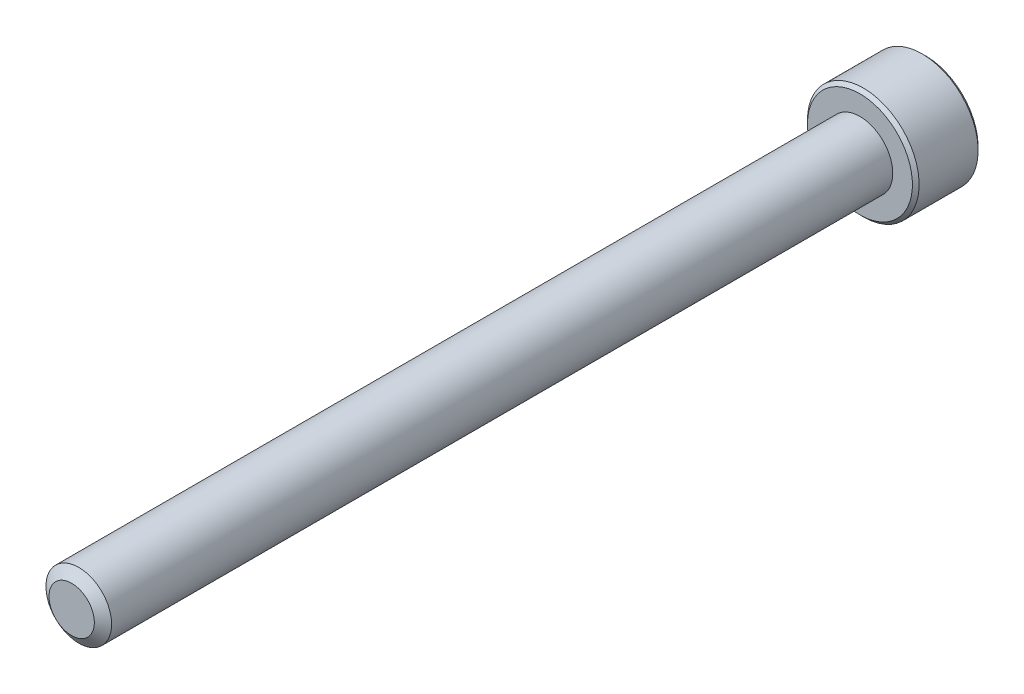
ISO-10303-21;
HEADER;
FILE_DESCRIPTION(('STEP AP214'),'2;1');
FILE_NAME('part.step','',(''),(''),'','','');
FILE_SCHEMA(('AUTOMOTIVE_DESIGN { 1 0 10303 214 1 1 1 1 }'));
ENDSEC;
DATA;
#1=APPLICATION_CONTEXT('core data for automotive mechanical design processes');
#2=APPLICATION_PROTOCOL_DEFINITION('international standard','automotive_design',2000,#1);
#3=PRODUCT_CONTEXT('',#1,'mechanical');
#4=PRODUCT('Part','Part','',(#3));
#5=PRODUCT_RELATED_PRODUCT_CATEGORY('part','',(#4));
#6=PRODUCT_DEFINITION_FORMATION('','',#4);
#7=PRODUCT_DEFINITION_CONTEXT('part definition',#1,'design');
#8=PRODUCT_DEFINITION('design','',#6,#7);
#9=PRODUCT_DEFINITION_SHAPE('','',#8);
#10=(LENGTH_UNIT() NAMED_UNIT(*) SI_UNIT(.MILLI.,.METRE.));
#11=(NAMED_UNIT(*) PLANE_ANGLE_UNIT() SI_UNIT($,.RADIAN.));
#12=(NAMED_UNIT(*) SI_UNIT($,.STERADIAN.) SOLID_ANGLE_UNIT());
#13=UNCERTAINTY_MEASURE_WITH_UNIT(LENGTH_MEASURE(1.E-05),#10,'distance_accuracy_value','');
#14=(GEOMETRIC_REPRESENTATION_CONTEXT(3) GLOBAL_UNCERTAINTY_ASSIGNED_CONTEXT((#13)) GLOBAL_UNIT_ASSIGNED_CONTEXT((#10,
#11,#12)) REPRESENTATION_CONTEXT('',''));
#15=CARTESIAN_POINT('',(0.,0.,0.));
#16=DIRECTION('',(0.,0.,1.));
#17=DIRECTION('',(1.,0.,0.));
#18=AXIS2_PLACEMENT_3D('',#15,#16,#17);
#19=CARTESIAN_POINT('',(0.,0.,-60.));
#20=DIRECTION('',(0.,0.,1.));
#21=DIRECTION('',(1.,0.,0.));
#22=AXIS2_PLACEMENT_3D('',#19,#20,#21);
#23=CYLINDRICAL_SURFACE('',#22,2.5);
#24=CARTESIAN_POINT('',(0.,0.,-0.541691224311849));
#25=DIRECTION('',(0.,0.,1.));
#26=DIRECTION('',(1.,0.,0.));
#27=AXIS2_PLACEMENT_3D('',#24,#25,#26);
#28=CIRCLE('',#27,2.5);
#29=CARTESIAN_POINT('',(2.5,0.,-0.541691224311849));
#30=VERTEX_POINT('',#29);
#31=EDGE_CURVE('E118',#30,#30,#28,.T.);
#32=ORIENTED_EDGE('',*,*,#31,.F.);
#33=EDGE_LOOP('',(#32));
#34=FACE_BOUND('',#33,.T.);
#35=CARTESIAN_POINT('',(0.,0.,-60.));
#36=DIRECTION('',(0.,0.,-1.));
#37=DIRECTION('',(-1.,0.,0.));
#38=AXIS2_PLACEMENT_3D('',#35,#36,#37);
#39=CIRCLE('',#38,2.5);
#40=CARTESIAN_POINT('',(-2.5,0.,-60.));
#41=VERTEX_POINT('',#40);
#42=EDGE_CURVE('E233',#41,#41,#39,.F.);
#43=ORIENTED_EDGE('',*,*,#42,.T.);
#44=EDGE_LOOP('',(#43));
#45=FACE_BOUND('',#44,.T.);
#46=ADVANCED_FACE('F41',(#34,#45),#23,.T.);
#47=CARTESIAN_POINT('',(0.,0.,0.));
#48=DIRECTION('',(0.,0.,-1.));
#49=DIRECTION('',(-1.,0.,0.));
#50=AXIS2_PLACEMENT_3D('',#47,#48,#49);
#51=CONICAL_SURFACE('',#50,1.72638475772933,0.959931088596884);
#52=ORIENTED_EDGE('',*,*,#31,.T.);
#53=EDGE_LOOP('',(#52));
#54=FACE_BOUND('',#53,.T.);
#55=CARTESIAN_POINT('',(0.,0.,0.));
#56=DIRECTION('',(0.,0.,1.));
#57=DIRECTION('',(1.,0.,0.));
#58=AXIS2_PLACEMENT_3D('',#55,#56,#57);
#59=CIRCLE('',#58,1.72638475772933);
#60=CARTESIAN_POINT('',(1.72638475772933,0.,0.));
#61=VERTEX_POINT('',#60);
#62=EDGE_CURVE('E230',#61,#61,#59,.T.);
#63=ORIENTED_EDGE('',*,*,#62,.F.);
#64=EDGE_LOOP('',(#63));
#65=FACE_BOUND('',#64,.T.);
#66=ADVANCED_FACE('F213',(#54,#65),#51,.T.);
#67=CARTESIAN_POINT('',(0.,0.,0.));
#68=DIRECTION('',(0.,0.,1.));
#69=DIRECTION('',(1.,0.,0.));
#70=AXIS2_PLACEMENT_3D('',#67,#68,#69);
#71=PLANE('',#70);
#72=ORIENTED_EDGE('',*,*,#62,.T.);
#73=EDGE_LOOP('',(#72));
#74=FACE_BOUND('',#73,.T.);
#75=ADVANCED_FACE('F210',(#74),#71,.T.);
#76=CARTESIAN_POINT('',(0.,0.,-65.));
#77=DIRECTION('',(0.,0.,1.));
#78=DIRECTION('',(1.,0.,0.));
#79=AXIS2_PLACEMENT_3D('',#76,#77,#78);
#80=CYLINDRICAL_SURFACE('',#79,4.25);
#81=CARTESIAN_POINT('',(0.,0.,-64.745));
#82=DIRECTION('',(0.,0.,-1.));
#83=DIRECTION('',(-1.,0.,0.));
#84=AXIS2_PLACEMENT_3D('',#81,#82,#83);
#85=CIRCLE('',#84,4.25);
#86=CARTESIAN_POINT('',(-4.25,0.,-64.745));
#87=VERTEX_POINT('',#86);
#88=EDGE_CURVE('E50',#87,#87,#85,.F.);
#89=ORIENTED_EDGE('',*,*,#88,.T.);
#90=EDGE_LOOP('',(#89));
#91=FACE_BOUND('',#90,.T.);
#92=CARTESIAN_POINT('',(0.,0.,-60.255));
#93=DIRECTION('',(0.,0.,-1.));
#94=DIRECTION('',(-1.,0.,0.));
#95=AXIS2_PLACEMENT_3D('',#92,#93,#94);
#96=CIRCLE('',#95,4.25);
#97=CARTESIAN_POINT('',(-4.25,0.,-60.255));
#98=VERTEX_POINT('',#97);
#99=EDGE_CURVE('E187',#98,#98,#96,.T.);
#100=ORIENTED_EDGE('',*,*,#99,.T.);
#101=EDGE_LOOP('',(#100));
#102=FACE_BOUND('',#101,.T.);
#103=ADVANCED_FACE('F194',(#91,#102),#80,.T.);
#104=CARTESIAN_POINT('',(0.,0.,-65.));
#105=DIRECTION('',(0.,0.,-1.));
#106=DIRECTION('',(-1.,0.,0.));
#107=AXIS2_PLACEMENT_3D('',#104,#105,#106);
#108=PLANE('',#107);
#109=CARTESIAN_POINT('',(0.,0.,-65.));
#110=DIRECTION('',(0.,0.,-1.));
#111=DIRECTION('',(-1.,0.,0.));
#112=AXIS2_PLACEMENT_3D('',#109,#110,#111);
#113=CIRCLE('',#112,3.99499999999998);
#114=CARTESIAN_POINT('',(-3.99499999999998,0.,-65.));
#115=VERTEX_POINT('',#114);
#116=EDGE_CURVE('E117',#115,#115,#113,.T.);
#117=ORIENTED_EDGE('',*,*,#116,.T.);
#118=EDGE_LOOP('',(#117));
#119=FACE_BOUND('',#118,.T.);
#120=CARTESIAN_POINT('',(0.,0.,-65.));
#121=DIRECTION('',(0.,0.,-1.));
#122=DIRECTION('',(-1.,0.,0.));
#123=AXIS2_PLACEMENT_3D('',#120,#121,#122);
#124=CIRCLE('',#123,2.3094010767585);
#125=CARTESIAN_POINT('',(-1.99999999999999,1.15470053837926,-65.));
#126=VERTEX_POINT('',#125);
#127=CARTESIAN_POINT('',(0.,2.3094010767585,-65.));
#128=VERTEX_POINT('',#127);
#129=EDGE_CURVE('E96',#126,#128,#124,.T.);
#130=ORIENTED_EDGE('',*,*,#129,.F.);
#131=CARTESIAN_POINT('',(-1.99999999999999,-1.15470053837926,-65.));
#132=VERTEX_POINT('',#131);
#133=EDGE_CURVE('E56',#132,#126,#124,.T.);
#134=ORIENTED_EDGE('',*,*,#133,.F.);
#135=CARTESIAN_POINT('',(0.,-2.3094010767585,-65.));
#136=VERTEX_POINT('',#135);
#137=EDGE_CURVE('E307',#136,#132,#124,.T.);
#138=ORIENTED_EDGE('',*,*,#137,.F.);
#139=CARTESIAN_POINT('',(1.99999999999999,-1.15470053837926,-65.));
#140=VERTEX_POINT('',#139);
#141=EDGE_CURVE('E63',#140,#136,#124,.T.);
#142=ORIENTED_EDGE('',*,*,#141,.F.);
#143=CARTESIAN_POINT('',(2.,1.15470053837926,-65.));
#144=VERTEX_POINT('',#143);
#145=EDGE_CURVE('E141',#144,#140,#124,.T.);
#146=ORIENTED_EDGE('',*,*,#145,.F.);
#147=EDGE_CURVE('E106',#128,#144,#124,.T.);
#148=ORIENTED_EDGE('',*,*,#147,.F.);
#149=EDGE_LOOP('',(#130,#134,#138,#142,#146,#148));
#150=FACE_BOUND('',#149,.T.);
#151=ADVANCED_FACE('F140',(#119,#150),#108,.T.);
#152=CARTESIAN_POINT('',(0.,0.,-60.));
#153=DIRECTION('',(0.,0.,-1.));
#154=DIRECTION('',(-1.,0.,0.));
#155=AXIS2_PLACEMENT_3D('',#152,#153,#154);
#156=PLANE('',#155);
#157=CARTESIAN_POINT('',(0.,0.,-60.));
#158=DIRECTION('',(0.,0.,-1.));
#159=DIRECTION('',(-1.,0.,0.));
#160=AXIS2_PLACEMENT_3D('',#157,#158,#159);
#161=CIRCLE('',#160,3.99499999999999);
#162=CARTESIAN_POINT('',(-3.99499999999999,0.,-60.));
#163=VERTEX_POINT('',#162);
#164=EDGE_CURVE('E11',#163,#163,#161,.F.);
#165=ORIENTED_EDGE('',*,*,#164,.T.);
#166=EDGE_LOOP('',(#165));
#167=FACE_BOUND('',#166,.T.);
#168=ORIENTED_EDGE('',*,*,#42,.F.);
#169=EDGE_LOOP('',(#168));
#170=FACE_BOUND('',#169,.T.);
#171=ADVANCED_FACE('F203',(#167,#170),#156,.F.);
#172=CARTESIAN_POINT('',(0.,0.,-65.));
#173=DIRECTION('',(0.,0.,-1.));
#174=DIRECTION('',(-1.,0.,0.));
#175=AXIS2_PLACEMENT_3D('',#172,#173,#174);
#176=CONICAL_SURFACE('',#175,2.3094010767585,0.78539816339745);
#177=ORIENTED_EDGE('',*,*,#147,.T.);
#178=CARTESIAN_POINT('',(-0.000199999999999274,2.30951654681234,-65.0001154787137));
#179=CARTESIAN_POINT('',(0.0685530340307071,2.26982196410711,-64.9604530902256));
#180=CARTESIAN_POINT('',(0.138455742135516,2.22946361676571,-64.9231199822842));
#181=CARTESIAN_POINT('',(0.280995244550443,2.1471683966763,-64.8547636851361));
#182=CARTESIAN_POINT('',(0.353645597565364,2.10522369580641,-64.8237785337372));
#183=CARTESIAN_POINT('',(0.500141601053975,2.02064418875706,-64.7707002165441));
#184=CARTESIAN_POINT('',(0.573949935246298,1.97803092714268,-64.7484736271766));
#185=CARTESIAN_POINT('',(0.723191631835266,1.89186619344273,-64.7142288166751));
#186=CARTESIAN_POINT('',(0.798620433918153,1.84831735425552,-64.7021850291441));
#187=CARTESIAN_POINT('',(0.92861550067108,1.7732646674724,-64.6913185119056));
#188=CARTESIAN_POINT('',(0.983013783970109,1.74185780396625,-64.68970975361));
#189=CARTESIAN_POINT('',(1.09172145551969,1.67909540053412,-64.6924188775987));
#190=CARTESIAN_POINT('',(1.14603080592134,1.64773988246021,-64.696738837758));
#191=CARTESIAN_POINT('',(1.25413672758934,1.5853248994842,-64.7110595674099));
#192=CARTESIAN_POINT('',(1.30793265655479,1.55426580541469,-64.721066692762));
#193=CARTESIAN_POINT('',(1.41459426230557,1.49268469862228,-64.7462124302497));
#194=CARTESIAN_POINT('',(1.46746001007071,1.46216264491917,-64.7613506490422));
#195=CARTESIAN_POINT('',(1.60287973308984,1.38397803138049,-64.8062945034292));
#196=CARTESIAN_POINT('',(1.68459383484948,1.33680037273297,-64.8394888394258));
#197=CARTESIAN_POINT('',(1.8047470372578,1.26742988897853,-64.8955258231714));
#198=CARTESIAN_POINT('',(1.84434285210917,1.24456923461531,-64.9152147029469));
#199=CARTESIAN_POINT('',(1.92280095888787,1.19927142554652,-64.9563873183649));
#200=CARTESIAN_POINT('',(1.96166368359374,1.17683402097615,-64.9778699516513));
#201=CARTESIAN_POINT('',(2.0002,1.15458506832542,-65.0001154787137));
#202=B_SPLINE_CURVE_WITH_KNOTS('',3,(#178,#179,#180,#181,#182,#183,#184,#185,#186,#187,#188,
#189,#190,#191,#192,#193,#194,#195,#196,#197,#198,#199,#200,#201),.UNSPECIFIED.,.F.,.F.,(4,2,2,
2,2,2,2,2,2,2,2,4),(0.,0.266420613771074,0.534393751523391,0.798110374376918,1.06116288956936,
1.24939906803722,1.43770123566247,1.62621426093931,1.81471283831913,2.11415604834145,
2.2634717071779,2.41269626969771),.UNSPECIFIED.);
#203=EDGE_CURVE('E111',#128,#144,#202,.T.);
#204=ORIENTED_EDGE('',*,*,#203,.F.);
#205=EDGE_LOOP('',(#177,#204));
#206=FACE_BOUND('',#205,.T.);
#207=ADVANCED_FACE('F112',(#206),#176,.F.);
#208=ORIENTED_EDGE('',*,*,#145,.T.);
#209=CARTESIAN_POINT('',(1.99999999999999,-2.3029441732643,-65.7407713552807));
#210=CARTESIAN_POINT('',(1.99999999999999,-2.24687002696279,-65.6984432738692));
#211=CARTESIAN_POINT('',(1.99999999999999,-2.19048190568583,-65.6565251570979));
#212=CARTESIAN_POINT('',(1.99999999999999,-2.07695390526152,-65.5736904180751));
#213=CARTESIAN_POINT('',(1.99999999999999,-2.01981384095229,-65.5327740498725));
#214=CARTESIAN_POINT('',(1.99999999999999,-1.90424016831613,-65.4518334522036));
#215=CARTESIAN_POINT('',(1.99999999999999,-1.84579996769762,-65.4118185917351));
#216=CARTESIAN_POINT('',(1.99999999999999,-1.72792745485624,-65.3332889938202));
#217=CARTESIAN_POINT('',(1.99999999999999,-1.66849521315185,-65.2947741503895));
#218=CARTESIAN_POINT('',(1.99999999999999,-1.48162995729572,-65.1776406517203));
#219=CARTESIAN_POINT('',(1.99999999999999,-1.35220318180736,-65.1021459018253));
#220=CARTESIAN_POINT('',(1.99999999999999,-1.08689521605219,-64.9640493510523));
#221=CARTESIAN_POINT('',(2.,-0.951037764035625,-64.901404085944));
#222=CARTESIAN_POINT('',(2.,-0.747111912337648,-64.8247635439027));
#223=CARTESIAN_POINT('',(2.,-0.682064034234154,-64.8027671799473));
#224=CARTESIAN_POINT('',(2.,-0.550398103397371,-64.7639966876877));
#225=CARTESIAN_POINT('',(2.,-0.483779942833396,-64.7472229191476));
#226=CARTESIAN_POINT('',(2.,-0.350484328974905,-64.7200482579067));
#227=CARTESIAN_POINT('',(2.,-0.28382948950006,-64.709538176761));
#228=CARTESIAN_POINT('',(2.,-0.14980698729043,-64.6950960855565));
#229=CARTESIAN_POINT('',(2.,-0.0824394490929301,-64.6911629447399));
#230=CARTESIAN_POINT('',(2.,0.0499055621213727,-64.6901664769296));
#231=CARTESIAN_POINT('',(2.,0.114881284963481,-64.6928596448403));
#232=CARTESIAN_POINT('',(2.,0.24427592129058,-64.7044300703996));
#233=CARTESIAN_POINT('',(2.,0.308694780068657,-64.7133079288031));
#234=CARTESIAN_POINT('',(2.,0.43759978840093,-64.7369136592514));
#235=CARTESIAN_POINT('',(2.,0.502067428429075,-64.7517410833941));
#236=CARTESIAN_POINT('',(2.,0.629594322371848,-64.78645788356));
#237=CARTESIAN_POINT('',(2.,0.6926536936515,-64.8063468360305));
#238=CARTESIAN_POINT('',(2.,0.891187888928451,-64.8764469791434));
#239=CARTESIAN_POINT('',(2.,1.02383545674825,-64.9346418001746));
#240=CARTESIAN_POINT('',(2.,1.28290932109376,-65.0640305752408));
#241=CARTESIAN_POINT('',(2.,1.40931112542929,-65.1352712311583));
#242=CARTESIAN_POINT('',(2.,1.59200441388851,-65.2464419915627));
#243=CARTESIAN_POINT('',(2.,1.65027548974477,-65.2831821900083));
#244=CARTESIAN_POINT('',(2.,1.7658176033435,-65.3582145138205));
#245=CARTESIAN_POINT('',(2.,1.82308856486634,-65.3965067567377));
#246=CARTESIAN_POINT('',(2.,1.93629654702496,-65.4740422636668));
#247=CARTESIAN_POINT('',(2.,1.99224062439411,-65.5132752757022));
#248=CARTESIAN_POINT('',(2.,2.10336423965702,-65.5927788302713));
#249=CARTESIAN_POINT('',(2.,2.1585439835674,-65.6330490845185));
#250=CARTESIAN_POINT('',(2.,2.21340370625403,-65.6737442376469));
#251=B_SPLINE_CURVE_WITH_KNOTS('',3,(#209,#210,#211,#212,#213,#214,#215,#216,#217,#218,#219,
#220,#221,#222,#223,#224,#225,#226,#227,#228,#229,#230,#231,#232,#233,#234,#235,#236,#237,#238,
#239,#240,#241,#242,#243,#244,#245,#246,#247,#248,#249,#250),.UNSPECIFIED.,.F.,.F.,(4,2,2,2,2,2,
2,2,2,2,2,2,2,2,2,2,2,2,2,2,4),(0.,0.210772732017012,0.421598374738841,0.634057554744647,
0.846501696032195,1.29562155480995,1.74319622856097,1.94902062142335,2.15485918958132,
2.35699582530216,2.55909770457495,2.75388435576874,2.94868993036094,3.14690093471669,
3.34509535806591,3.7783815583877,4.21325029906864,4.41989056664093,4.62654651432576,
4.83152377076245,5.03644465872342),.UNSPECIFIED.);
#252=EDGE_CURVE('E105',#144,#140,#251,.F.);
#253=ORIENTED_EDGE('',*,*,#252,.F.);
#254=EDGE_LOOP('',(#208,#253));
#255=FACE_BOUND('',#254,.T.);
#256=ADVANCED_FACE('F318',(#255),#176,.F.);
#257=ORIENTED_EDGE('',*,*,#141,.T.);
#258=CARTESIAN_POINT('',(2.0002,-1.15458506832541,-65.0001154787137));
#259=CARTESIAN_POINT('',(1.93144696596929,-1.19427965103065,-64.9604530902256));
#260=CARTESIAN_POINT('',(1.86154425786448,-1.23463799837204,-64.9231199822842));
#261=CARTESIAN_POINT('',(1.71900475544955,-1.31693321846145,-64.8547636851361));
#262=CARTESIAN_POINT('',(1.64635440243463,-1.35887791933134,-64.8237785337372));
#263=CARTESIAN_POINT('',(1.49985839894602,-1.4434574263807,-64.7707002165441));
#264=CARTESIAN_POINT('',(1.4260500647537,-1.48607068799507,-64.7484736271766));
#265=CARTESIAN_POINT('',(1.27680836816473,-1.57223542169503,-64.7142288166751));
#266=CARTESIAN_POINT('',(1.20137956608184,-1.61578426088224,-64.7021850291441));
#267=CARTESIAN_POINT('',(1.07138449932891,-1.69083694766536,-64.6913185119056));
#268=CARTESIAN_POINT('',(1.01698621602988,-1.72224381117151,-64.68970975361));
#269=CARTESIAN_POINT('',(0.9082785444803,-1.78500621460364,-64.6924188775987));
#270=CARTESIAN_POINT('',(0.853969194078654,-1.81636173267754,-64.696738837758));
#271=CARTESIAN_POINT('',(0.745863272410655,-1.87877671565356,-64.7110595674099));
#272=CARTESIAN_POINT('',(0.692067343445202,-1.90983580972307,-64.721066692762));
#273=CARTESIAN_POINT('',(0.58540573769442,-1.97141691651548,-64.7462124302497));
#274=CARTESIAN_POINT('',(0.532539989929281,-2.00193897021859,-64.7613506490422));
#275=CARTESIAN_POINT('',(0.39712026691015,-2.08012358375727,-64.8062945034292));
#276=CARTESIAN_POINT('',(0.315406165150517,-2.12730124240479,-64.8394888394258));
#277=CARTESIAN_POINT('',(0.195252962742195,-2.19667172615923,-64.8955258231714));
#278=CARTESIAN_POINT('',(0.155657147890821,-2.21953238052245,-64.915214702947));
#279=CARTESIAN_POINT('',(0.0771990411121276,-2.26483018959124,-64.9563873183649));
#280=CARTESIAN_POINT('',(0.0383363164062603,-2.28726759416161,-64.9778699516513));
#281=CARTESIAN_POINT('',(-0.000199999999999238,-2.30951654681234,-65.0001154787137));
#282=B_SPLINE_CURVE_WITH_KNOTS('',3,(#258,#259,#260,#261,#262,#263,#264,#265,#266,#267,#268,
#269,#270,#271,#272,#273,#274,#275,#276,#277,#278,#279,#280,#281),.UNSPECIFIED.,.F.,.F.,(4,2,2,
2,2,2,2,2,2,2,2,4),(0.,0.266420613771074,0.534393751523392,0.798110374376918,1.06116288956937,
1.24939906803722,1.43770123566248,1.62621426093932,1.81471283831914,2.11415604834145,
2.26347170717791,2.41269626969771),.UNSPECIFIED.);
#283=EDGE_CURVE('E154',#140,#136,#282,.T.);
#284=ORIENTED_EDGE('',*,*,#283,.F.);
#285=EDGE_LOOP('',(#257,#284));
#286=FACE_BOUND('',#285,.T.);
#287=ADVANCED_FACE('F315',(#286),#176,.F.);
#288=ORIENTED_EDGE('',*,*,#137,.T.);
#289=CARTESIAN_POINT('',(0.000199999999999847,-2.30951654681234,-65.0001154787137));
#290=CARTESIAN_POINT('',(-0.0685530340307052,-2.26982196410711,-64.9604530902256));
#291=CARTESIAN_POINT('',(-0.138455742135514,-2.22946361676572,-64.9231199822842));
#292=CARTESIAN_POINT('',(-0.280995244550441,-2.1471683966763,-64.8547636851361));
#293=CARTESIAN_POINT('',(-0.353645597565363,-2.10522369580642,-64.8237785337372));
#294=CARTESIAN_POINT('',(-0.500141601053975,-2.02064418875706,-64.7707002165441));
#295=CARTESIAN_POINT('',(-0.573949935246296,-1.97803092714269,-64.7484736271766));
#296=CARTESIAN_POINT('',(-0.723191631835264,-1.89186619344273,-64.7142288166751));
#297=CARTESIAN_POINT('',(-0.798620433918152,-1.84831735425552,-64.7021850291441));
#298=CARTESIAN_POINT('',(-0.928615500671079,-1.7732646674724,-64.6913185119056));
#299=CARTESIAN_POINT('',(-0.983013783970109,-1.74185780396625,-64.68970975361));
#300=CARTESIAN_POINT('',(-1.09172145551969,-1.67909540053412,-64.6924188775987));
#301=CARTESIAN_POINT('',(-1.14603080592134,-1.64773988246022,-64.696738837758));
#302=CARTESIAN_POINT('',(-1.25413672758934,-1.5853248994842,-64.7110595674099));
#303=CARTESIAN_POINT('',(-1.30793265655479,-1.55426580541469,-64.721066692762));
#304=CARTESIAN_POINT('',(-1.41459426230557,-1.49268469862228,-64.7462124302497));
#305=CARTESIAN_POINT('',(-1.46746001007071,-1.46216264491917,-64.7613506490422));
#306=CARTESIAN_POINT('',(-1.60287973308984,-1.38397803138049,-64.8062945034292));
#307=CARTESIAN_POINT('',(-1.68459383484948,-1.33680037273297,-64.8394888394258));
#308=CARTESIAN_POINT('',(-1.8047470372578,-1.26742988897853,-64.8955258231714));
#309=CARTESIAN_POINT('',(-1.84434285210918,-1.24456923461531,-64.9152147029469));
#310=CARTESIAN_POINT('',(-1.92280095888787,-1.19927142554652,-64.9563873183649));
#311=CARTESIAN_POINT('',(-1.96166368359374,-1.17683402097615,-64.9778699516513));
#312=CARTESIAN_POINT('',(-2.00019999999999,-1.15458506832542,-65.0001154787137));
#313=B_SPLINE_CURVE_WITH_KNOTS('',3,(#289,#290,#291,#292,#293,#294,#295,#296,#297,#298,#299,
#300,#301,#302,#303,#304,#305,#306,#307,#308,#309,#310,#311,#312),.UNSPECIFIED.,.F.,.F.,(4,2,2,
2,2,2,2,2,2,2,2,4),(0.,0.266420613771071,0.534393751523392,0.798110374376916,1.06116288956936,
1.24939906803722,1.43770123566248,1.62621426093932,1.81471283831913,2.11415604834145,
2.2634717071779,2.4126962696977),.UNSPECIFIED.);
#314=EDGE_CURVE('E284',#136,#132,#313,.T.);
#315=ORIENTED_EDGE('',*,*,#314,.F.);
#316=EDGE_LOOP('',(#288,#315));
#317=FACE_BOUND('',#316,.T.);
#318=ADVANCED_FACE('F312',(#317),#176,.F.);
#319=ORIENTED_EDGE('',*,*,#133,.T.);
#320=CARTESIAN_POINT('',(-1.99999999999999,-2.30294417292924,-65.7407713550277));
#321=CARTESIAN_POINT('',(-1.99999999999999,-2.24687002663713,-65.698443273626));
#322=CARTESIAN_POINT('',(-1.99999999999999,-2.1904819053696,-65.6565251568643));
#323=CARTESIAN_POINT('',(-1.99999999999999,-2.07695390496425,-65.573690417861));
#324=CARTESIAN_POINT('',(-1.99999999999999,-2.01981384066455,-65.5327740496681));
#325=CARTESIAN_POINT('',(-1.99999999999999,-1.90424016804777,-65.4518334520186));
#326=CARTESIAN_POINT('',(-1.99999999999999,-1.84579996743911,-65.4118185915599));
#327=CARTESIAN_POINT('',(-1.99999999999999,-1.72792745461761,-65.3332889936643));
#328=CARTESIAN_POINT('',(-1.99999999999999,-1.66849521292325,-65.2947741502432));
#329=CARTESIAN_POINT('',(-1.99999999999999,-1.4816299571002,-65.1776406516043));
#330=CARTESIAN_POINT('',(-1.99999999999999,-1.35220318163537,-65.1021459017297));
#331=CARTESIAN_POINT('',(-1.99999999999999,-1.08689521592925,-64.9640493509944));
#332=CARTESIAN_POINT('',(-1.99999999999999,-0.951037763938195,-64.9014040859035));
#333=CARTESIAN_POINT('',(-1.99999999999999,-0.747111912259411,-64.8247635438752));
#334=CARTESIAN_POINT('',(-1.99999999999999,-0.682064034147879,-64.8027671799191));
#335=CARTESIAN_POINT('',(-1.99999999999999,-0.550398103294758,-64.7639966876601));
#336=CARTESIAN_POINT('',(-1.99999999999999,-0.483779942722482,-64.7472229191212));
#337=CARTESIAN_POINT('',(-1.99999999999999,-0.350484328847663,-64.7200482578845));
#338=CARTESIAN_POINT('',(-1.99999999999999,-0.283829489364795,-64.7095381767417));
#339=CARTESIAN_POINT('',(-1.99999999999999,-0.149806987139387,-64.6950960855449));
#340=CARTESIAN_POINT('',(-1.99999999999999,-0.0824394489341326,-64.6911629447331));
#341=CARTESIAN_POINT('',(-1.99999999999999,0.0499055622944787,-64.6901664769337));
#342=CARTESIAN_POINT('',(-1.99999999999999,0.114881285143161,-64.6928596448504));
#343=CARTESIAN_POINT('',(-1.99999999999999,0.244275921482749,-64.7044300704227));
#344=CARTESIAN_POINT('',(-1.99999999999999,0.308694780266742,-64.7133079288332));
#345=CARTESIAN_POINT('',(-1.99999999999999,0.437599788610693,-64.7369136592961));
#346=CARTESIAN_POINT('',(-1.99999999999999,0.502067428644582,-64.7517410834465));
#347=CARTESIAN_POINT('',(-1.99999999999999,0.629594322598294,-64.786457883628));
#348=CARTESIAN_POINT('',(-1.99999999999999,0.69265369388314,-64.8063468361063));
#349=CARTESIAN_POINT('',(-1.99999999999999,0.891187889210533,-64.8764469792562));
#350=CARTESIAN_POINT('',(-1.99999999999999,1.02383545707304,-64.9346418003215));
#351=CARTESIAN_POINT('',(-1.99999999999999,1.28290932150072,-65.0640305754596));
#352=CARTESIAN_POINT('',(-1.99999999999999,1.40931112587568,-65.1352712314148));
#353=CARTESIAN_POINT('',(-1.99999999999999,1.59200441438961,-65.2464419918747));
#354=CARTESIAN_POINT('',(-1.99999999999999,1.65027549026189,-65.2831821903374));
#355=CARTESIAN_POINT('',(-1.99999999999999,1.7658176038924,-65.3582145141837));
#356=CARTESIAN_POINT('',(-1.99999999999999,1.82308856543102,-65.396506757118));
#357=CARTESIAN_POINT('',(-1.99999999999999,1.93629654762082,-65.4740422640812));
#358=CARTESIAN_POINT('',(-1.99999999999999,1.99224062500536,-65.5132752761336));
#359=CARTESIAN_POINT('',(-1.99999999999999,2.10336424029897,-65.5927788307365));
#360=CARTESIAN_POINT('',(-1.99999999999999,2.15854398422465,-65.6330490850006));
#361=CARTESIAN_POINT('',(-1.99999999999999,2.21340370692656,-65.6737442381459));
#362=B_SPLINE_CURVE_WITH_KNOTS('',3,(#320,#321,#322,#323,#324,#325,#326,#327,#328,#329,#330,
#331,#332,#333,#334,#335,#336,#337,#338,#339,#340,#341,#342,#343,#344,#345,#346,#347,#348,#349,
#350,#351,#352,#353,#354,#355,#356,#357,#358,#359,#360,#361),.UNSPECIFIED.,.F.,.F.,(4,2,2,2,2,2,
2,2,2,2,2,2,2,2,2,2,2,2,2,2,4),(0.,0.21077273197688,0.421598374658577,0.634057554623476,
0.846501695870158,1.29562155455623,1.74319622821645,1.94902062110207,2.15485918928325,
2.35699582502634,2.55909770432139,2.75388435553555,2.94868993014814,3.14690093452585,
3.34509535789701,3.77838155837651,4.21325029921622,4.41989056685644,4.62654651460918,
4.83152377111287,5.03644465914082),.UNSPECIFIED.);
#363=EDGE_CURVE('E129',#132,#126,#362,.T.);
#364=ORIENTED_EDGE('',*,*,#363,.F.);
#365=EDGE_LOOP('',(#319,#364));
#366=FACE_BOUND('',#365,.T.);
#367=ADVANCED_FACE('F327',(#366),#176,.F.);
#368=ORIENTED_EDGE('',*,*,#129,.T.);
#369=CARTESIAN_POINT('',(-2.0002,1.15458506832541,-65.0001154787137));
#370=CARTESIAN_POINT('',(-1.93144696596929,1.19427965103065,-64.9604530902256));
#371=CARTESIAN_POINT('',(-1.86154425786448,1.23463799837204,-64.9231199822842));
#372=CARTESIAN_POINT('',(-1.71900475544955,1.31693321846146,-64.8547636851361));
#373=CARTESIAN_POINT('',(-1.64635440243463,1.35887791933134,-64.8237785337372));
#374=CARTESIAN_POINT('',(-1.49985839894602,1.4434574263807,-64.7707002165441));
#375=CARTESIAN_POINT('',(-1.4260500647537,1.48607068799507,-64.7484736271766));
#376=CARTESIAN_POINT('',(-1.27680836816473,1.57223542169503,-64.7142288166751));
#377=CARTESIAN_POINT('',(-1.20137956608184,1.61578426088224,-64.7021850291441));
#378=CARTESIAN_POINT('',(-1.07138449932891,1.69083694766536,-64.6913185119056));
#379=CARTESIAN_POINT('',(-1.01698621602988,1.72224381117151,-64.68970975361));
#380=CARTESIAN_POINT('',(-0.908278544480298,1.78500621460364,-64.6924188775987));
#381=CARTESIAN_POINT('',(-0.853969194078652,1.81636173267754,-64.696738837758));
#382=CARTESIAN_POINT('',(-0.745863272410653,1.87877671565356,-64.7110595674099));
#383=CARTESIAN_POINT('',(-0.692067343445198,1.90983580972307,-64.721066692762));
#384=CARTESIAN_POINT('',(-0.585405737694417,1.97141691651548,-64.7462124302497));
#385=CARTESIAN_POINT('',(-0.532539989929278,2.00193897021859,-64.7613506490422));
#386=CARTESIAN_POINT('',(-0.397120266910147,2.08012358375727,-64.8062945034292));
#387=CARTESIAN_POINT('',(-0.31540616515051,2.12730124240479,-64.8394888394258));
#388=CARTESIAN_POINT('',(-0.195252962742188,2.19667172615923,-64.8955258231714));
#389=CARTESIAN_POINT('',(-0.155657147890815,2.21953238052245,-64.915214702947));
#390=CARTESIAN_POINT('',(-0.0771990411121227,2.26483018959124,-64.9563873183649));
#391=CARTESIAN_POINT('',(-0.0383363164062567,2.28726759416161,-64.9778699516513));
#392=CARTESIAN_POINT('',(0.000200000000003866,2.30951654681234,-65.0001154787137));
#393=B_SPLINE_CURVE_WITH_KNOTS('',3,(#369,#370,#371,#372,#373,#374,#375,#376,#377,#378,#379,
#380,#381,#382,#383,#384,#385,#386,#387,#388,#389,#390,#391,#392),.UNSPECIFIED.,.F.,.F.,(4,2,2,
2,2,2,2,2,2,2,2,4),(0.,0.266420613771074,0.534393751523393,0.798110374376919,1.06116288956937,
1.24939906803722,1.43770123566248,1.62621426093932,1.81471283831914,2.11415604834145,
2.26347170717791,2.41269626969771),.UNSPECIFIED.);
#394=EDGE_CURVE('E100',#126,#128,#393,.T.);
#395=ORIENTED_EDGE('',*,*,#394,.F.);
#396=EDGE_LOOP('',(#368,#395));
#397=FACE_BOUND('',#396,.T.);
#398=ADVANCED_FACE('F98',(#397),#176,.F.);
#399=CARTESIAN_POINT('',(-1.99999999999999,1.15470053837925,-62.));
#400=DIRECTION('',(0.,0.,1.));
#401=DIRECTION('',(1.,0.,0.));
#402=AXIS2_PLACEMENT_3D('',#399,#400,#401);
#403=PLANE('',#402);
#404=DIRECTION('',(0.866025403784439,0.5,0.));
#405=VECTOR('',#404,1.);
#406=CARTESIAN_POINT('',(-1.99999999999999,1.15470053837925,-62.));
#407=LINE('',#406,#405);
#408=CARTESIAN_POINT('',(-1.99999999999999,1.15470053837925,-62.));
#409=VERTEX_POINT('',#408);
#410=CARTESIAN_POINT('',(0.,2.3094010767585,-62.));
#411=VERTEX_POINT('',#410);
#412=EDGE_CURVE('E128',#409,#411,#407,.T.);
#413=ORIENTED_EDGE('',*,*,#412,.T.);
#414=DIRECTION('',(0.866025403784439,-0.499999999999999,0.));
#415=VECTOR('',#414,1.);
#416=CARTESIAN_POINT('',(0.,2.3094010767585,-62.));
#417=LINE('',#416,#415);
#418=CARTESIAN_POINT('',(2.,1.15470053837926,-62.));
#419=VERTEX_POINT('',#418);
#420=EDGE_CURVE('E133',#411,#419,#417,.T.);
#421=ORIENTED_EDGE('',*,*,#420,.T.);
#422=DIRECTION('',(0.,-1.,0.));
#423=VECTOR('',#422,1.);
#424=CARTESIAN_POINT('',(2.,1.15470053837926,-62.));
#425=LINE('',#424,#423);
#426=CARTESIAN_POINT('',(1.99999999999999,-1.15470053837925,-62.));
#427=VERTEX_POINT('',#426);
#428=EDGE_CURVE('E266',#419,#427,#425,.T.);
#429=ORIENTED_EDGE('',*,*,#428,.T.);
#430=DIRECTION('',(-0.866025403784438,-0.500000000000001,0.));
#431=VECTOR('',#430,1.);
#432=CARTESIAN_POINT('',(1.99999999999999,-1.15470053837925,-62.));
#433=LINE('',#432,#431);
#434=CARTESIAN_POINT('',(0.,-2.3094010767585,-62.));
#435=VERTEX_POINT('',#434);
#436=EDGE_CURVE('E262',#427,#435,#433,.T.);
#437=ORIENTED_EDGE('',*,*,#436,.T.);
#438=DIRECTION('',(-0.866025403784439,0.5,0.));
#439=VECTOR('',#438,1.);
#440=CARTESIAN_POINT('',(0.,-2.3094010767585,-62.));
#441=LINE('',#440,#439);
#442=CARTESIAN_POINT('',(-1.99999999999999,-1.15470053837926,-62.));
#443=VERTEX_POINT('',#442);
#444=EDGE_CURVE('E258',#435,#443,#441,.T.);
#445=ORIENTED_EDGE('',*,*,#444,.T.);
#446=DIRECTION('',(0.,1.,0.));
#447=VECTOR('',#446,1.);
#448=CARTESIAN_POINT('',(-1.99999999999999,-1.15470053837926,-62.));
#449=LINE('',#448,#447);
#450=EDGE_CURVE('E137',#443,#409,#449,.T.);
#451=ORIENTED_EDGE('',*,*,#450,.T.);
#452=EDGE_LOOP('',(#413,#421,#429,#437,#445,#451));
#453=FACE_BOUND('',#452,.T.);
#454=ADVANCED_FACE('F174',(#453),#403,.F.);
#455=CARTESIAN_POINT('',(0.,2.3094010767585,-62.));
#456=DIRECTION('',(0.499999999999999,0.866025403784439,0.));
#457=DIRECTION('',(-0.866025403784439,0.499999999999999,0.));
#458=AXIS2_PLACEMENT_3D('',#455,#456,#457);
#459=PLANE('',#458);
#460=DIRECTION('',(0.,0.,-1.));
#461=VECTOR('',#460,1.);
#462=CARTESIAN_POINT('',(0.,2.3094010767585,-62.));
#463=LINE('',#462,#461);
#464=EDGE_CURVE('E124',#411,#128,#463,.T.);
#465=ORIENTED_EDGE('',*,*,#464,.T.);
#466=ORIENTED_EDGE('',*,*,#203,.T.);
#467=DIRECTION('',(0.,0.,-1.));
#468=VECTOR('',#467,1.);
#469=CARTESIAN_POINT('',(2.,1.15470053837926,-62.));
#470=LINE('',#469,#468);
#471=EDGE_CURVE('E136',#419,#144,#470,.T.);
#472=ORIENTED_EDGE('',*,*,#471,.F.);
#473=ORIENTED_EDGE('',*,*,#420,.F.);
#474=EDGE_LOOP('',(#465,#466,#472,#473));
#475=FACE_BOUND('',#474,.T.);
#476=ADVANCED_FACE('F131',(#475),#459,.F.);
#477=CARTESIAN_POINT('',(2.,1.15470053837926,-62.));
#478=DIRECTION('',(1.,0.,0.));
#479=DIRECTION('',(0.,1.,0.));
#480=AXIS2_PLACEMENT_3D('',#477,#478,#479);
#481=PLANE('',#480);
#482=ORIENTED_EDGE('',*,*,#471,.T.);
#483=ORIENTED_EDGE('',*,*,#252,.T.);
#484=DIRECTION('',(0.,0.,-1.));
#485=VECTOR('',#484,1.);
#486=CARTESIAN_POINT('',(1.99999999999999,-1.15470053837925,-62.));
#487=LINE('',#486,#485);
#488=EDGE_CURVE('E242',#427,#140,#487,.T.);
#489=ORIENTED_EDGE('',*,*,#488,.F.);
#490=ORIENTED_EDGE('',*,*,#428,.F.);
#491=EDGE_LOOP('',(#482,#483,#489,#490));
#492=FACE_BOUND('',#491,.T.);
#493=ADVANCED_FACE('F163',(#492),#481,.F.);
#494=CARTESIAN_POINT('',(1.99999999999999,-1.15470053837925,-62.));
#495=DIRECTION('',(0.500000000000001,-0.866025403784438,0.));
#496=DIRECTION('',(0.866025403784438,0.500000000000001,0.));
#497=AXIS2_PLACEMENT_3D('',#494,#495,#496);
#498=PLANE('',#497);
#499=ORIENTED_EDGE('',*,*,#488,.T.);
#500=ORIENTED_EDGE('',*,*,#283,.T.);
#501=DIRECTION('',(0.,0.,-1.));
#502=VECTOR('',#501,1.);
#503=CARTESIAN_POINT('',(0.,-2.3094010767585,-62.));
#504=LINE('',#503,#502);
#505=EDGE_CURVE('E246',#435,#136,#504,.T.);
#506=ORIENTED_EDGE('',*,*,#505,.F.);
#507=ORIENTED_EDGE('',*,*,#436,.F.);
#508=EDGE_LOOP('',(#499,#500,#506,#507));
#509=FACE_BOUND('',#508,.T.);
#510=ADVANCED_FACE('F167',(#509),#498,.F.);
#511=CARTESIAN_POINT('',(0.,-2.3094010767585,-62.));
#512=DIRECTION('',(-0.5,-0.866025403784439,0.));
#513=DIRECTION('',(0.866025403784439,-0.5,0.));
#514=AXIS2_PLACEMENT_3D('',#511,#512,#513);
#515=PLANE('',#514);
#516=ORIENTED_EDGE('',*,*,#505,.T.);
#517=ORIENTED_EDGE('',*,*,#314,.T.);
#518=DIRECTION('',(0.,0.,-1.));
#519=VECTOR('',#518,1.);
#520=CARTESIAN_POINT('',(-1.99999999999999,-1.15470053837926,-62.));
#521=LINE('',#520,#519);
#522=EDGE_CURVE('E250',#443,#132,#521,.T.);
#523=ORIENTED_EDGE('',*,*,#522,.F.);
#524=ORIENTED_EDGE('',*,*,#444,.F.);
#525=EDGE_LOOP('',(#516,#517,#523,#524));
#526=FACE_BOUND('',#525,.T.);
#527=ADVANCED_FACE('F292',(#526),#515,.F.);
#528=CARTESIAN_POINT('',(-1.99999999999999,-1.15470053837926,-62.));
#529=DIRECTION('',(-1.,0.,0.));
#530=DIRECTION('',(0.,0.,1.));
#531=AXIS2_PLACEMENT_3D('',#528,#529,#530);
#532=PLANE('',#531);
#533=ORIENTED_EDGE('',*,*,#522,.T.);
#534=ORIENTED_EDGE('',*,*,#363,.T.);
#535=DIRECTION('',(0.,0.,-1.));
#536=VECTOR('',#535,1.);
#537=CARTESIAN_POINT('',(-1.99999999999999,1.15470053837925,-62.));
#538=LINE('',#537,#536);
#539=EDGE_CURVE('E126',#409,#126,#538,.T.);
#540=ORIENTED_EDGE('',*,*,#539,.F.);
#541=ORIENTED_EDGE('',*,*,#450,.F.);
#542=EDGE_LOOP('',(#533,#534,#540,#541));
#543=FACE_BOUND('',#542,.T.);
#544=ADVANCED_FACE('F289',(#543),#532,.F.);
#545=CARTESIAN_POINT('',(-1.99999999999999,1.15470053837925,-62.));
#546=DIRECTION('',(-0.5,0.866025403784439,0.));
#547=DIRECTION('',(-0.866025403784439,-0.5,0.));
#548=AXIS2_PLACEMENT_3D('',#545,#546,#547);
#549=PLANE('',#548);
#550=ORIENTED_EDGE('',*,*,#539,.T.);
#551=ORIENTED_EDGE('',*,*,#394,.T.);
#552=ORIENTED_EDGE('',*,*,#464,.F.);
#553=ORIENTED_EDGE('',*,*,#412,.F.);
#554=EDGE_LOOP('',(#550,#551,#552,#553));
#555=FACE_BOUND('',#554,.T.);
#556=ADVANCED_FACE('F122',(#555),#549,.F.);
#557=CARTESIAN_POINT('',(0.,0.,-65.));
#558=DIRECTION('',(0.,0.,1.));
#559=DIRECTION('',(1.,0.,0.));
#560=AXIS2_PLACEMENT_3D('',#557,#558,#559);
#561=CONICAL_SURFACE('',#560,3.99499999999998,0.785398163397455);
#562=ORIENTED_EDGE('',*,*,#88,.F.);
#563=EDGE_LOOP('',(#562));
#564=FACE_BOUND('',#563,.T.);
#565=ORIENTED_EDGE('',*,*,#116,.F.);
#566=EDGE_LOOP('',(#565));
#567=FACE_BOUND('',#566,.T.);
#568=ADVANCED_FACE('F197',(#564,#567),#561,.T.);
#569=CARTESIAN_POINT('',(0.,0.,-60.255));
#570=DIRECTION('',(0.,0.,-1.));
#571=DIRECTION('',(-1.,0.,0.));
#572=AXIS2_PLACEMENT_3D('',#569,#570,#571);
#573=CONICAL_SURFACE('',#572,4.25,0.785398163397455);
#574=ORIENTED_EDGE('',*,*,#164,.F.);
#575=EDGE_LOOP('',(#574));
#576=FACE_BOUND('',#575,.T.);
#577=ORIENTED_EDGE('',*,*,#99,.F.);
#578=EDGE_LOOP('',(#577));
#579=FACE_BOUND('',#578,.T.);
#580=ADVANCED_FACE('F43',(#576,#579),#573,.T.);
#581=CLOSED_SHELL('',(#46,#66,#75,#103,#151,#171,#207,#256,#287,#318,#367,#398,#454,#476,#493,
#510,#527,#544,#556,#568,#580));
#582=MANIFOLD_SOLID_BREP('B2',#581);
#583=ADVANCED_BREP_SHAPE_REPRESENTATION('',(#18,#582),#14);
#584=SHAPE_DEFINITION_REPRESENTATION(#9,#583);
ENDSEC;
END-ISO-10303-21;
